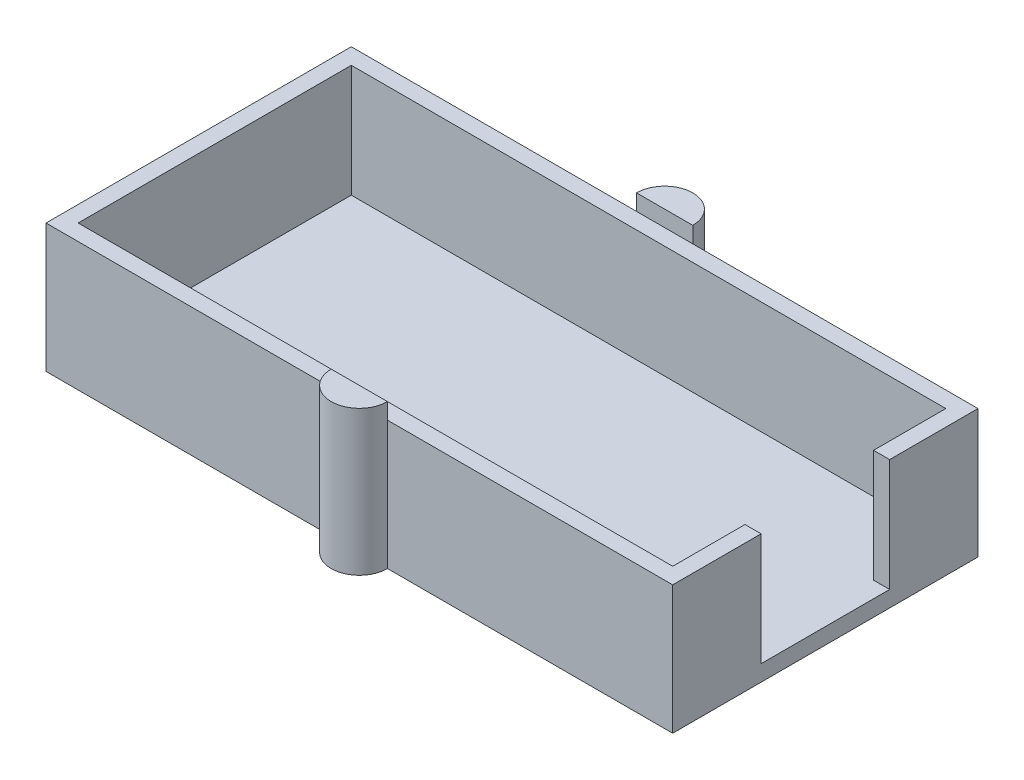
ISO-10303-21;
HEADER;
FILE_DESCRIPTION(('STEP AP214'),'2;1');
FILE_NAME('part.step','',(''),(''),'','','');
FILE_SCHEMA(('AUTOMOTIVE_DESIGN { 1 0 10303 214 1 1 1 1 }'));
ENDSEC;
DATA;
#1=APPLICATION_CONTEXT('core data for automotive mechanical design processes');
#2=APPLICATION_PROTOCOL_DEFINITION('international standard','automotive_design',2000,#1);
#3=PRODUCT_CONTEXT('',#1,'mechanical');
#4=PRODUCT('Part','Part','',(#3));
#5=PRODUCT_RELATED_PRODUCT_CATEGORY('part','',(#4));
#6=PRODUCT_DEFINITION_FORMATION('','',#4);
#7=PRODUCT_DEFINITION_CONTEXT('part definition',#1,'design');
#8=PRODUCT_DEFINITION('design','',#6,#7);
#9=PRODUCT_DEFINITION_SHAPE('','',#8);
#10=(LENGTH_UNIT() NAMED_UNIT(*) SI_UNIT(.MILLI.,.METRE.));
#11=(NAMED_UNIT(*) PLANE_ANGLE_UNIT() SI_UNIT($,.RADIAN.));
#12=(NAMED_UNIT(*) SI_UNIT($,.STERADIAN.) SOLID_ANGLE_UNIT());
#13=UNCERTAINTY_MEASURE_WITH_UNIT(LENGTH_MEASURE(1.E-05),#10,'distance_accuracy_value','');
#14=(GEOMETRIC_REPRESENTATION_CONTEXT(3) GLOBAL_UNCERTAINTY_ASSIGNED_CONTEXT((#13)) GLOBAL_UNIT_ASSIGNED_CONTEXT((#10,
#11,#12)) REPRESENTATION_CONTEXT('',''));
#15=CARTESIAN_POINT('',(0.,0.,0.));
#16=DIRECTION('',(0.,0.,1.));
#17=DIRECTION('',(1.,0.,0.));
#18=AXIS2_PLACEMENT_3D('',#15,#16,#17);
#19=CARTESIAN_POINT('',(51.1184091382947,7.,-21.1566621553229));
#20=DIRECTION('',(-1.,0.,0.));
#21=DIRECTION('',(0.,0.,1.));
#22=AXIS2_PLACEMENT_3D('',#19,#20,#21);
#23=PLANE('',#22);
#24=DIRECTION('',(0.,1.,0.));
#25=VECTOR('',#24,1.);
#26=CARTESIAN_POINT('',(51.1184091382947,7.,-8.65666215532292));
#27=LINE('',#26,#25);
#28=CARTESIAN_POINT('',(51.1184091382947,0.,-8.65666215532292));
#29=VERTEX_POINT('',#28);
#30=CARTESIAN_POINT('',(51.1184091382947,7.,-8.65666215532292));
#31=VERTEX_POINT('',#30);
#32=EDGE_CURVE('E191',#29,#31,#27,.T.);
#33=ORIENTED_EDGE('',*,*,#32,.F.);
#34=DIRECTION('',(0.,0.,-1.));
#35=VECTOR('',#34,1.);
#36=CARTESIAN_POINT('',(51.1184091382947,0.,-21.1566621553229));
#37=LINE('',#36,#35);
#38=CARTESIAN_POINT('',(51.1184091382947,0.,-4.15666215532293));
#39=VERTEX_POINT('',#38);
#40=EDGE_CURVE('E165',#39,#29,#37,.T.);
#41=ORIENTED_EDGE('',*,*,#40,.F.);
#42=DIRECTION('',(0.,-1.,0.));
#43=VECTOR('',#42,1.);
#44=CARTESIAN_POINT('',(51.1184091382947,7.,-4.15666215532293));
#45=LINE('',#44,#43);
#46=CARTESIAN_POINT('',(51.1184091382947,7.,-4.15666215532293));
#47=VERTEX_POINT('',#46);
#48=EDGE_CURVE('E272',#47,#39,#45,.T.);
#49=ORIENTED_EDGE('',*,*,#48,.F.);
#50=DIRECTION('',(0.,0.,-1.));
#51=VECTOR('',#50,1.);
#52=CARTESIAN_POINT('',(51.1184091382947,7.,-21.1566621553229));
#53=LINE('',#52,#51);
#54=EDGE_CURVE('E255',#47,#31,#53,.T.);
#55=ORIENTED_EDGE('',*,*,#54,.T.);
#56=EDGE_LOOP('',(#33,#41,#49,#55));
#57=FACE_BOUND('',#56,.T.);
#58=ADVANCED_FACE('F33',(#57),#23,.T.);
#59=CARTESIAN_POINT('',(13.1184091382947,7.,-3.15666215532293));
#60=DIRECTION('',(0.,0.,-1.));
#61=DIRECTION('',(-1.,0.,0.));
#62=AXIS2_PLACEMENT_3D('',#59,#60,#61);
#63=PLANE('',#62);
#64=DIRECTION('',(1.,0.,0.));
#65=VECTOR('',#64,1.);
#66=CARTESIAN_POINT('',(13.1184091382947,7.,-3.15666215532293));
#67=LINE('',#66,#65);
#68=CARTESIAN_POINT('',(34.3684091382947,7.,-3.15666215532293));
#69=VERTEX_POINT('',#68);
#70=CARTESIAN_POINT('',(52.1184091382947,7.,-3.15666215532293));
#71=VERTEX_POINT('',#70);
#72=EDGE_CURVE('E280',#69,#71,#67,.T.);
#73=ORIENTED_EDGE('',*,*,#72,.F.);
#74=DIRECTION('',(0.,1.,0.));
#75=VECTOR('',#74,1.);
#76=CARTESIAN_POINT('',(34.3684091382947,-1.,-3.15666215532293));
#77=LINE('',#76,#75);
#78=CARTESIAN_POINT('',(34.3684091382947,-1.,-3.15666215532293));
#79=VERTEX_POINT('',#78);
#80=EDGE_CURVE('E243',#79,#69,#77,.T.);
#81=ORIENTED_EDGE('',*,*,#80,.F.);
#82=DIRECTION('',(-1.,0.,0.));
#83=VECTOR('',#82,1.);
#84=CARTESIAN_POINT('',(34.3684091382947,-1.,-3.15666215532293));
#85=LINE('',#84,#83);
#86=CARTESIAN_POINT('',(52.1184091382947,-1.,-3.15666215532293));
#87=VERTEX_POINT('',#86);
#88=EDGE_CURVE('E234',#87,#79,#85,.T.);
#89=ORIENTED_EDGE('',*,*,#88,.F.);
#90=DIRECTION('',(0.,-1.,0.));
#91=VECTOR('',#90,1.);
#92=CARTESIAN_POINT('',(52.1184091382947,7.,-3.15666215532293));
#93=LINE('',#92,#91);
#94=EDGE_CURVE('E41',#71,#87,#93,.T.);
#95=ORIENTED_EDGE('',*,*,#94,.F.);
#96=EDGE_LOOP('',(#73,#81,#89,#95));
#97=FACE_BOUND('',#96,.T.);
#98=ADVANCED_FACE('F304',(#97),#63,.F.);
#99=DIRECTION('',(0.,1.,0.));
#100=VECTOR('',#99,1.);
#101=CARTESIAN_POINT('',(30.8684091382947,-1.,-3.15666215532293));
#102=LINE('',#101,#100);
#103=CARTESIAN_POINT('',(30.8684091382947,-1.,-3.15666215532293));
#104=VERTEX_POINT('',#103);
#105=CARTESIAN_POINT('',(30.8684091382947,7.,-3.15666215532293));
#106=VERTEX_POINT('',#105);
#107=EDGE_CURVE('E241',#104,#106,#102,.T.);
#108=ORIENTED_EDGE('',*,*,#107,.T.);
#109=CARTESIAN_POINT('',(13.1184091382947,7.,-3.15666215532293));
#110=VERTEX_POINT('',#109);
#111=EDGE_CURVE('E281',#110,#106,#67,.T.);
#112=ORIENTED_EDGE('',*,*,#111,.F.);
#113=DIRECTION('',(0.,-1.,0.));
#114=VECTOR('',#113,1.);
#115=CARTESIAN_POINT('',(13.1184091382947,7.,-3.15666215532293));
#116=LINE('',#115,#114);
#117=CARTESIAN_POINT('',(13.1184091382947,-1.,-3.15666215532293));
#118=VERTEX_POINT('',#117);
#119=EDGE_CURVE('E11',#110,#118,#116,.T.);
#120=ORIENTED_EDGE('',*,*,#119,.T.);
#121=DIRECTION('',(-1.,0.,0.));
#122=VECTOR('',#121,1.);
#123=CARTESIAN_POINT('',(13.1184091382947,-1.,-3.15666215532293));
#124=LINE('',#123,#122);
#125=EDGE_CURVE('E238',#104,#118,#124,.T.);
#126=ORIENTED_EDGE('',*,*,#125,.F.);
#127=EDGE_LOOP('',(#108,#112,#120,#126));
#128=FACE_BOUND('',#127,.T.);
#129=ADVANCED_FACE('F359',(#128),#63,.F.);
#130=CARTESIAN_POINT('',(13.1184091382947,7.,-22.1566621553229));
#131=DIRECTION('',(0.,0.,1.));
#132=DIRECTION('',(1.,0.,0.));
#133=AXIS2_PLACEMENT_3D('',#130,#131,#132);
#134=PLANE('',#133);
#135=DIRECTION('',(-1.,0.,0.));
#136=VECTOR('',#135,1.);
#137=CARTESIAN_POINT('',(13.1184091382947,7.,-22.1566621553229));
#138=LINE('',#137,#136);
#139=CARTESIAN_POINT('',(30.8684091382947,7.,-22.1566621553228));
#140=VERTEX_POINT('',#139);
#141=CARTESIAN_POINT('',(13.1184091382947,7.,-22.1566621553229));
#142=VERTEX_POINT('',#141);
#143=EDGE_CURVE('E287',#140,#142,#138,.T.);
#144=ORIENTED_EDGE('',*,*,#143,.F.);
#145=DIRECTION('',(0.,1.,0.));
#146=VECTOR('',#145,1.);
#147=CARTESIAN_POINT('',(30.8684091382947,-1.,-22.1566621553229));
#148=LINE('',#147,#146);
#149=CARTESIAN_POINT('',(30.8684091382947,-1.,-22.1566621553229));
#150=VERTEX_POINT('',#149);
#151=EDGE_CURVE('E247',#150,#140,#148,.T.);
#152=ORIENTED_EDGE('',*,*,#151,.F.);
#153=DIRECTION('',(1.,0.,0.));
#154=VECTOR('',#153,1.);
#155=CARTESIAN_POINT('',(13.1184091382947,-1.,-22.1566621553229));
#156=LINE('',#155,#154);
#157=CARTESIAN_POINT('',(13.1184091382947,-1.,-22.1566621553229));
#158=VERTEX_POINT('',#157);
#159=EDGE_CURVE('E224',#158,#150,#156,.T.);
#160=ORIENTED_EDGE('',*,*,#159,.F.);
#161=DIRECTION('',(0.,-1.,0.));
#162=VECTOR('',#161,1.);
#163=CARTESIAN_POINT('',(13.1184091382947,7.,-22.1566621553229));
#164=LINE('',#163,#162);
#165=EDGE_CURVE('E291',#142,#158,#164,.T.);
#166=ORIENTED_EDGE('',*,*,#165,.F.);
#167=EDGE_LOOP('',(#144,#152,#160,#166));
#168=FACE_BOUND('',#167,.T.);
#169=ADVANCED_FACE('F321',(#168),#134,.F.);
#170=DIRECTION('',(0.,1.,0.));
#171=VECTOR('',#170,1.);
#172=CARTESIAN_POINT('',(34.3684091382947,-1.,-22.1566621553229));
#173=LINE('',#172,#171);
#174=CARTESIAN_POINT('',(34.3684091382947,-1.,-22.1566621553229));
#175=VERTEX_POINT('',#174);
#176=CARTESIAN_POINT('',(34.3684091382947,7.,-22.1566621553229));
#177=VERTEX_POINT('',#176);
#178=EDGE_CURVE('E245',#175,#177,#173,.T.);
#179=ORIENTED_EDGE('',*,*,#178,.T.);
#180=CARTESIAN_POINT('',(52.1184091382947,7.,-22.1566621553229));
#181=VERTEX_POINT('',#180);
#182=EDGE_CURVE('E288',#181,#177,#138,.T.);
#183=ORIENTED_EDGE('',*,*,#182,.F.);
#184=DIRECTION('',(0.,-1.,0.));
#185=VECTOR('',#184,1.);
#186=CARTESIAN_POINT('',(52.1184091382947,7.,-22.1566621553229));
#187=LINE('',#186,#185);
#188=CARTESIAN_POINT('',(52.1184091382947,-1.,-22.1566621553229));
#189=VERTEX_POINT('',#188);
#190=EDGE_CURVE('E293',#181,#189,#187,.T.);
#191=ORIENTED_EDGE('',*,*,#190,.T.);
#192=DIRECTION('',(1.,0.,0.));
#193=VECTOR('',#192,1.);
#194=CARTESIAN_POINT('',(34.3684091382947,-1.,-22.1566621553229));
#195=LINE('',#194,#193);
#196=EDGE_CURVE('E228',#175,#189,#195,.T.);
#197=ORIENTED_EDGE('',*,*,#196,.F.);
#198=EDGE_LOOP('',(#179,#183,#191,#197));
#199=FACE_BOUND('',#198,.T.);
#200=ADVANCED_FACE('F331',(#199),#134,.F.);
#201=CARTESIAN_POINT('',(0.,7.,0.));
#202=DIRECTION('',(0.,1.,0.));
#203=DIRECTION('',(0.,0.,1.));
#204=AXIS2_PLACEMENT_3D('',#201,#202,#203);
#205=PLANE('',#204);
#206=DIRECTION('',(1.,0.,0.));
#207=VECTOR('',#206,1.);
#208=CARTESIAN_POINT('',(44.1184091382947,7.,-8.65666215532292));
#209=LINE('',#208,#207);
#210=CARTESIAN_POINT('',(52.1184091382947,7.,-8.65666215532292));
#211=VERTEX_POINT('',#210);
#212=EDGE_CURVE('E174',#31,#211,#209,.T.);
#213=ORIENTED_EDGE('',*,*,#212,.F.);
#214=ORIENTED_EDGE('',*,*,#54,.F.);
#215=DIRECTION('',(1.,0.,0.));
#216=VECTOR('',#215,1.);
#217=CARTESIAN_POINT('',(14.1184091382947,7.,-4.15666215532293));
#218=LINE('',#217,#216);
#219=CARTESIAN_POINT('',(14.1184091382947,7.,-4.15666215532293));
#220=VERTEX_POINT('',#219);
#221=EDGE_CURVE('E252',#220,#47,#218,.T.);
#222=ORIENTED_EDGE('',*,*,#221,.F.);
#223=DIRECTION('',(0.,0.,1.));
#224=VECTOR('',#223,1.);
#225=CARTESIAN_POINT('',(14.1184091382947,7.,-21.1566621553229));
#226=LINE('',#225,#224);
#227=CARTESIAN_POINT('',(14.1184091382947,7.,-21.1566621553229));
#228=VERTEX_POINT('',#227);
#229=EDGE_CURVE('E250',#228,#220,#226,.T.);
#230=ORIENTED_EDGE('',*,*,#229,.F.);
#231=DIRECTION('',(-1.,0.,0.));
#232=VECTOR('',#231,1.);
#233=CARTESIAN_POINT('',(14.1184091382947,7.,-21.1566621553229));
#234=LINE('',#233,#232);
#235=CARTESIAN_POINT('',(51.1184091382947,7.,-21.1566621553229));
#236=VERTEX_POINT('',#235);
#237=EDGE_CURVE('E258',#236,#228,#234,.T.);
#238=ORIENTED_EDGE('',*,*,#237,.F.);
#239=CARTESIAN_POINT('',(51.1184091382947,7.,-16.6566621553229));
#240=VERTEX_POINT('',#239);
#241=EDGE_CURVE('E56',#240,#236,#53,.T.);
#242=ORIENTED_EDGE('',*,*,#241,.F.);
#243=DIRECTION('',(1.,0.,0.));
#244=VECTOR('',#243,1.);
#245=CARTESIAN_POINT('',(44.1184091382947,7.,-16.6566621553229));
#246=LINE('',#245,#244);
#247=CARTESIAN_POINT('',(52.1184091382947,7.,-16.6566621553229));
#248=VERTEX_POINT('',#247);
#249=EDGE_CURVE('E186',#240,#248,#246,.T.);
#250=ORIENTED_EDGE('',*,*,#249,.T.);
#251=DIRECTION('',(0.,0.,-1.));
#252=VECTOR('',#251,1.);
#253=CARTESIAN_POINT('',(52.1184091382947,7.,-22.1566621553229));
#254=LINE('',#253,#252);
#255=EDGE_CURVE('E284',#248,#181,#254,.T.);
#256=ORIENTED_EDGE('',*,*,#255,.T.);
#257=ORIENTED_EDGE('',*,*,#182,.T.);
#258=DIRECTION('',(-1.,0.,0.));
#259=VECTOR('',#258,1.);
#260=CARTESIAN_POINT('',(-8.12640133505464E-13,7.,-22.1566621553217));
#261=LINE('',#260,#259);
#262=EDGE_CURVE('E218',#177,#140,#261,.T.);
#263=ORIENTED_EDGE('',*,*,#262,.T.);
#264=ORIENTED_EDGE('',*,*,#143,.T.);
#265=DIRECTION('',(0.,0.,1.));
#266=VECTOR('',#265,1.);
#267=CARTESIAN_POINT('',(13.1184091382947,7.,-22.1566621553229));
#268=LINE('',#267,#266);
#269=EDGE_CURVE('E277',#142,#110,#268,.T.);
#270=ORIENTED_EDGE('',*,*,#269,.T.);
#271=ORIENTED_EDGE('',*,*,#111,.T.);
#272=DIRECTION('',(1.,0.,0.));
#273=VECTOR('',#272,1.);
#274=CARTESIAN_POINT('',(0.,7.,-3.15666215532293));
#275=LINE('',#274,#273);
#276=EDGE_CURVE('E204',#106,#69,#275,.T.);
#277=ORIENTED_EDGE('',*,*,#276,.T.);
#278=ORIENTED_EDGE('',*,*,#72,.T.);
#279=EDGE_CURVE('E285',#71,#211,#254,.T.);
#280=ORIENTED_EDGE('',*,*,#279,.T.);
#281=EDGE_LOOP('',(#213,#214,#222,#230,#238,#242,#250,#256,#257,#263,#264,#270,#271,#277,#278,#280));
#282=FACE_BOUND('',#281,.T.);
#283=ADVANCED_FACE('F333',(#282),#205,.T.);
#284=CARTESIAN_POINT('',(13.1184091382947,7.,-22.1566621553229));
#285=DIRECTION('',(1.,0.,0.));
#286=DIRECTION('',(0.,0.,-1.));
#287=AXIS2_PLACEMENT_3D('',#284,#285,#286);
#288=PLANE('',#287);
#289=ORIENTED_EDGE('',*,*,#165,.T.);
#290=DIRECTION('',(0.,0.,-1.));
#291=VECTOR('',#290,1.);
#292=CARTESIAN_POINT('',(13.1184091382947,-1.,-3.15666215532293));
#293=LINE('',#292,#291);
#294=EDGE_CURVE('E221',#118,#158,#293,.T.);
#295=ORIENTED_EDGE('',*,*,#294,.F.);
#296=ORIENTED_EDGE('',*,*,#119,.F.);
#297=ORIENTED_EDGE('',*,*,#269,.F.);
#298=EDGE_LOOP('',(#289,#295,#296,#297));
#299=FACE_BOUND('',#298,.T.);
#300=ADVANCED_FACE('F35',(#299),#288,.F.);
#301=CARTESIAN_POINT('',(52.1184091382947,7.,-22.1566621553229));
#302=DIRECTION('',(-1.,0.,0.));
#303=DIRECTION('',(0.,0.,1.));
#304=AXIS2_PLACEMENT_3D('',#301,#302,#303);
#305=PLANE('',#304);
#306=DIRECTION('',(0.,0.,-1.));
#307=VECTOR('',#306,1.);
#308=CARTESIAN_POINT('',(52.1184091382947,0.,-8.65666215532292));
#309=LINE('',#308,#307);
#310=CARTESIAN_POINT('',(52.1184091382947,0.,-8.65666215532292));
#311=VERTEX_POINT('',#310);
#312=CARTESIAN_POINT('',(52.1184091382947,0.,-16.6566621553229));
#313=VERTEX_POINT('',#312);
#314=EDGE_CURVE('E161',#311,#313,#309,.T.);
#315=ORIENTED_EDGE('',*,*,#314,.F.);
#316=DIRECTION('',(0.,-1.,0.));
#317=VECTOR('',#316,1.);
#318=CARTESIAN_POINT('',(52.1184091382947,7.,-8.65666215532292));
#319=LINE('',#318,#317);
#320=EDGE_CURVE('E171',#211,#311,#319,.T.);
#321=ORIENTED_EDGE('',*,*,#320,.F.);
#322=ORIENTED_EDGE('',*,*,#279,.F.);
#323=ORIENTED_EDGE('',*,*,#94,.T.);
#324=DIRECTION('',(0.,0.,1.));
#325=VECTOR('',#324,1.);
#326=CARTESIAN_POINT('',(52.1184091382947,-1.,-3.15666215532293));
#327=LINE('',#326,#325);
#328=EDGE_CURVE('E231',#189,#87,#327,.T.);
#329=ORIENTED_EDGE('',*,*,#328,.F.);
#330=ORIENTED_EDGE('',*,*,#190,.F.);
#331=ORIENTED_EDGE('',*,*,#255,.F.);
#332=DIRECTION('',(0.,1.,0.));
#333=VECTOR('',#332,1.);
#334=CARTESIAN_POINT('',(52.1184091382947,7.,-16.6566621553229));
#335=LINE('',#334,#333);
#336=EDGE_CURVE('E168',#313,#248,#335,.T.);
#337=ORIENTED_EDGE('',*,*,#336,.F.);
#338=EDGE_LOOP('',(#315,#321,#322,#323,#329,#330,#331,#337));
#339=FACE_BOUND('',#338,.T.);
#340=ADVANCED_FACE('F179',(#339),#305,.F.);
#341=CARTESIAN_POINT('',(14.1184091382947,7.,-21.1566621553229));
#342=DIRECTION('',(1.,0.,0.));
#343=DIRECTION('',(0.,0.,-1.));
#344=AXIS2_PLACEMENT_3D('',#341,#342,#343);
#345=PLANE('',#344);
#346=DIRECTION('',(0.,0.,1.));
#347=VECTOR('',#346,1.);
#348=CARTESIAN_POINT('',(14.1184091382947,0.,-21.1566621553229));
#349=LINE('',#348,#347);
#350=CARTESIAN_POINT('',(14.1184091382947,0.,-21.1566621553229));
#351=VERTEX_POINT('',#350);
#352=CARTESIAN_POINT('',(14.1184091382947,0.,-4.15666215532293));
#353=VERTEX_POINT('',#352);
#354=EDGE_CURVE('E249',#351,#353,#349,.T.);
#355=ORIENTED_EDGE('',*,*,#354,.F.);
#356=DIRECTION('',(0.,-1.,0.));
#357=VECTOR('',#356,1.);
#358=CARTESIAN_POINT('',(14.1184091382947,7.,-21.1566621553229));
#359=LINE('',#358,#357);
#360=EDGE_CURVE('E260',#228,#351,#359,.T.);
#361=ORIENTED_EDGE('',*,*,#360,.F.);
#362=ORIENTED_EDGE('',*,*,#229,.T.);
#363=DIRECTION('',(0.,-1.,0.));
#364=VECTOR('',#363,1.);
#365=CARTESIAN_POINT('',(14.1184091382947,7.,-4.15666215532293));
#366=LINE('',#365,#364);
#367=EDGE_CURVE('E274',#220,#353,#366,.T.);
#368=ORIENTED_EDGE('',*,*,#367,.T.);
#369=EDGE_LOOP('',(#355,#361,#362,#368));
#370=FACE_BOUND('',#369,.T.);
#371=ADVANCED_FACE('F346',(#370),#345,.T.);
#372=CARTESIAN_POINT('',(14.1184091382947,7.,-4.15666215532293));
#373=DIRECTION('',(0.,0.,-1.));
#374=DIRECTION('',(-1.,0.,0.));
#375=AXIS2_PLACEMENT_3D('',#372,#373,#374);
#376=PLANE('',#375);
#377=DIRECTION('',(1.,0.,0.));
#378=VECTOR('',#377,1.);
#379=CARTESIAN_POINT('',(14.1184091382947,0.,-4.15666215532293));
#380=LINE('',#379,#378);
#381=EDGE_CURVE('E263',#353,#39,#380,.T.);
#382=ORIENTED_EDGE('',*,*,#381,.F.);
#383=ORIENTED_EDGE('',*,*,#367,.F.);
#384=ORIENTED_EDGE('',*,*,#221,.T.);
#385=ORIENTED_EDGE('',*,*,#48,.T.);
#386=EDGE_LOOP('',(#382,#383,#384,#385));
#387=FACE_BOUND('',#386,.T.);
#388=ADVANCED_FACE('F350',(#387),#376,.T.);
#389=DIRECTION('',(0.,-1.,0.));
#390=VECTOR('',#389,1.);
#391=CARTESIAN_POINT('',(51.1184091382947,7.,-16.6566621553229));
#392=LINE('',#391,#390);
#393=CARTESIAN_POINT('',(51.1184091382947,0.,-16.6566621553229));
#394=VERTEX_POINT('',#393);
#395=EDGE_CURVE('E185',#240,#394,#392,.T.);
#396=ORIENTED_EDGE('',*,*,#395,.F.);
#397=ORIENTED_EDGE('',*,*,#241,.T.);
#398=DIRECTION('',(0.,-1.,0.));
#399=VECTOR('',#398,1.);
#400=CARTESIAN_POINT('',(51.1184091382947,7.,-21.1566621553229));
#401=LINE('',#400,#399);
#402=CARTESIAN_POINT('',(51.1184091382947,0.,-21.1566621553229));
#403=VERTEX_POINT('',#402);
#404=EDGE_CURVE('E270',#236,#403,#401,.T.);
#405=ORIENTED_EDGE('',*,*,#404,.T.);
#406=EDGE_CURVE('E265',#394,#403,#37,.T.);
#407=ORIENTED_EDGE('',*,*,#406,.F.);
#408=EDGE_LOOP('',(#396,#397,#405,#407));
#409=FACE_BOUND('',#408,.T.);
#410=ADVANCED_FACE('F338',(#409),#23,.T.);
#411=CARTESIAN_POINT('',(14.1184091382947,7.,-21.1566621553229));
#412=DIRECTION('',(0.,0.,1.));
#413=DIRECTION('',(1.,0.,0.));
#414=AXIS2_PLACEMENT_3D('',#411,#412,#413);
#415=PLANE('',#414);
#416=DIRECTION('',(-1.,0.,0.));
#417=VECTOR('',#416,1.);
#418=CARTESIAN_POINT('',(14.1184091382947,0.,-21.1566621553229));
#419=LINE('',#418,#417);
#420=EDGE_CURVE('E253',#403,#351,#419,.T.);
#421=ORIENTED_EDGE('',*,*,#420,.F.);
#422=ORIENTED_EDGE('',*,*,#404,.F.);
#423=ORIENTED_EDGE('',*,*,#237,.T.);
#424=ORIENTED_EDGE('',*,*,#360,.T.);
#425=EDGE_LOOP('',(#421,#422,#423,#424));
#426=FACE_BOUND('',#425,.T.);
#427=ADVANCED_FACE('F342',(#426),#415,.T.);
#428=CARTESIAN_POINT('',(32.6184091382947,0.,-22.1566621553229));
#429=DIRECTION('',(0.,-1.,0.));
#430=DIRECTION('',(0.,0.,-1.));
#431=AXIS2_PLACEMENT_3D('',#428,#429,#430);
#432=PLANE('',#431);
#433=ORIENTED_EDGE('',*,*,#40,.T.);
#434=DIRECTION('',(1.,0.,0.));
#435=VECTOR('',#434,1.);
#436=CARTESIAN_POINT('',(44.1184091382947,0.,-8.65666215532292));
#437=LINE('',#436,#435);
#438=EDGE_CURVE('E157',#29,#311,#437,.T.);
#439=ORIENTED_EDGE('',*,*,#438,.T.);
#440=ORIENTED_EDGE('',*,*,#314,.T.);
#441=DIRECTION('',(1.,0.,0.));
#442=VECTOR('',#441,1.);
#443=CARTESIAN_POINT('',(44.1184091382947,0.,-16.6566621553229));
#444=LINE('',#443,#442);
#445=EDGE_CURVE('E48',#394,#313,#444,.T.);
#446=ORIENTED_EDGE('',*,*,#445,.F.);
#447=ORIENTED_EDGE('',*,*,#406,.T.);
#448=ORIENTED_EDGE('',*,*,#420,.T.);
#449=ORIENTED_EDGE('',*,*,#354,.T.);
#450=ORIENTED_EDGE('',*,*,#381,.T.);
#451=EDGE_LOOP('',(#433,#439,#440,#446,#447,#448,#449,#450));
#452=FACE_BOUND('',#451,.T.);
#453=ADVANCED_FACE('F159',(#452),#432,.F.);
#454=CARTESIAN_POINT('',(32.6184091382947,-1.,-22.1566621553229));
#455=DIRECTION('',(0.,1.,0.));
#456=DIRECTION('',(0.,0.,1.));
#457=AXIS2_PLACEMENT_3D('',#454,#455,#456);
#458=CYLINDRICAL_SURFACE('',#457,1.75);
#459=ORIENTED_EDGE('',*,*,#151,.T.);
#460=DIRECTION('',(0.,-1.,0.));
#461=VECTOR('',#460,1.);
#462=CARTESIAN_POINT('',(30.8684091382947,8.,-22.1566621553228));
#463=LINE('',#462,#461);
#464=CARTESIAN_POINT('',(30.8684091382947,8.,-22.1566621553228));
#465=VERTEX_POINT('',#464);
#466=EDGE_CURVE('E215',#465,#140,#463,.T.);
#467=ORIENTED_EDGE('',*,*,#466,.F.);
#468=CARTESIAN_POINT('',(32.6184091382947,8.,-22.1566621553228));
#469=DIRECTION('',(0.,1.,0.));
#470=DIRECTION('',(0.,0.,1.));
#471=AXIS2_PLACEMENT_3D('',#468,#469,#470);
#472=CIRCLE('',#471,1.75);
#473=CARTESIAN_POINT('',(34.3684091382947,8.,-22.1566621553229));
#474=VERTEX_POINT('',#473);
#475=EDGE_CURVE('E207',#474,#465,#472,.T.);
#476=ORIENTED_EDGE('',*,*,#475,.F.);
#477=DIRECTION('',(0.,-1.,0.));
#478=VECTOR('',#477,1.);
#479=CARTESIAN_POINT('',(34.3684091382947,8.,-22.1566621553229));
#480=LINE('',#479,#478);
#481=EDGE_CURVE('E212',#474,#177,#480,.T.);
#482=ORIENTED_EDGE('',*,*,#481,.T.);
#483=ORIENTED_EDGE('',*,*,#178,.F.);
#484=CARTESIAN_POINT('',(32.6184091382947,-1.,-22.1566621553229));
#485=DIRECTION('',(0.,-1.,0.));
#486=DIRECTION('',(0.,0.,-1.));
#487=AXIS2_PLACEMENT_3D('',#484,#485,#486);
#488=CIRCLE('',#487,1.75);
#489=EDGE_CURVE('E226',#150,#175,#488,.T.);
#490=ORIENTED_EDGE('',*,*,#489,.F.);
#491=EDGE_LOOP('',(#459,#467,#476,#482,#483,#490));
#492=FACE_BOUND('',#491,.T.);
#493=ADVANCED_FACE('F325',(#492),#458,.T.);
#494=CARTESIAN_POINT('',(32.6184091382947,-1.,-3.15666215532293));
#495=DIRECTION('',(0.,1.,0.));
#496=DIRECTION('',(0.,0.,1.));
#497=AXIS2_PLACEMENT_3D('',#494,#495,#496);
#498=CYLINDRICAL_SURFACE('',#497,1.75);
#499=ORIENTED_EDGE('',*,*,#80,.T.);
#500=DIRECTION('',(0.,-1.,0.));
#501=VECTOR('',#500,1.);
#502=CARTESIAN_POINT('',(34.3684091382947,8.,-3.15666215532293));
#503=LINE('',#502,#501);
#504=CARTESIAN_POINT('',(34.3684091382947,8.,-3.15666215532293));
#505=VERTEX_POINT('',#504);
#506=EDGE_CURVE('E201',#505,#69,#503,.T.);
#507=ORIENTED_EDGE('',*,*,#506,.F.);
#508=CARTESIAN_POINT('',(32.6184091382947,8.,-3.15666215532293));
#509=DIRECTION('',(0.,1.,0.));
#510=DIRECTION('',(0.,0.,1.));
#511=AXIS2_PLACEMENT_3D('',#508,#509,#510);
#512=CIRCLE('',#511,1.75);
#513=CARTESIAN_POINT('',(30.8684091382947,8.,-3.15666215532293));
#514=VERTEX_POINT('',#513);
#515=EDGE_CURVE('E193',#514,#505,#512,.T.);
#516=ORIENTED_EDGE('',*,*,#515,.F.);
#517=DIRECTION('',(0.,-1.,0.));
#518=VECTOR('',#517,1.);
#519=CARTESIAN_POINT('',(30.8684091382947,8.,-3.15666215532293));
#520=LINE('',#519,#518);
#521=EDGE_CURVE('E198',#514,#106,#520,.T.);
#522=ORIENTED_EDGE('',*,*,#521,.T.);
#523=ORIENTED_EDGE('',*,*,#107,.F.);
#524=CARTESIAN_POINT('',(32.6184091382947,-1.,-3.15666215532293));
#525=DIRECTION('',(0.,-1.,0.));
#526=DIRECTION('',(0.,0.,-1.));
#527=AXIS2_PLACEMENT_3D('',#524,#525,#526);
#528=CIRCLE('',#527,1.75);
#529=EDGE_CURVE('E236',#79,#104,#528,.T.);
#530=ORIENTED_EDGE('',*,*,#529,.F.);
#531=EDGE_LOOP('',(#499,#507,#516,#522,#523,#530));
#532=FACE_BOUND('',#531,.T.);
#533=ADVANCED_FACE('F309',(#532),#498,.T.);
#534=CARTESIAN_POINT('',(32.6184091382947,-1.,-22.1566621553229));
#535=DIRECTION('',(0.,-1.,0.));
#536=DIRECTION('',(0.,0.,-1.));
#537=AXIS2_PLACEMENT_3D('',#534,#535,#536);
#538=PLANE('',#537);
#539=ORIENTED_EDGE('',*,*,#294,.T.);
#540=ORIENTED_EDGE('',*,*,#159,.T.);
#541=ORIENTED_EDGE('',*,*,#489,.T.);
#542=ORIENTED_EDGE('',*,*,#196,.T.);
#543=ORIENTED_EDGE('',*,*,#328,.T.);
#544=ORIENTED_EDGE('',*,*,#88,.T.);
#545=ORIENTED_EDGE('',*,*,#529,.T.);
#546=ORIENTED_EDGE('',*,*,#125,.T.);
#547=EDGE_LOOP('',(#539,#540,#541,#542,#543,#544,#545,#546));
#548=FACE_BOUND('',#547,.T.);
#549=ADVANCED_FACE('F301',(#548),#538,.T.);
#550=CARTESIAN_POINT('',(30.8684091382947,8.,-22.1566621553228));
#551=DIRECTION('',(0.,0.,-1.));
#552=DIRECTION('',(-1.,0.,0.));
#553=AXIS2_PLACEMENT_3D('',#550,#551,#552);
#554=PLANE('',#553);
#555=ORIENTED_EDGE('',*,*,#262,.F.);
#556=ORIENTED_EDGE('',*,*,#481,.F.);
#557=DIRECTION('',(1.,0.,0.));
#558=VECTOR('',#557,1.);
#559=CARTESIAN_POINT('',(30.8684091382947,8.,-22.1566621553228));
#560=LINE('',#559,#558);
#561=EDGE_CURVE('E210',#465,#474,#560,.T.);
#562=ORIENTED_EDGE('',*,*,#561,.F.);
#563=ORIENTED_EDGE('',*,*,#466,.T.);
#564=EDGE_LOOP('',(#555,#556,#562,#563));
#565=FACE_BOUND('',#564,.T.);
#566=ADVANCED_FACE('F417',(#565),#554,.F.);
#567=CARTESIAN_POINT('',(32.6184091382947,8.,-22.1566621553228));
#568=DIRECTION('',(0.,1.,0.));
#569=DIRECTION('',(0.,0.,1.));
#570=AXIS2_PLACEMENT_3D('',#567,#568,#569);
#571=PLANE('',#570);
#572=ORIENTED_EDGE('',*,*,#475,.T.);
#573=ORIENTED_EDGE('',*,*,#561,.T.);
#574=EDGE_LOOP('',(#572,#573));
#575=FACE_BOUND('',#574,.T.);
#576=ADVANCED_FACE('F486',(#575),#571,.T.);
#577=CARTESIAN_POINT('',(30.8684091382947,8.,-3.15666215532293));
#578=DIRECTION('',(0.,0.,1.));
#579=DIRECTION('',(1.,0.,0.));
#580=AXIS2_PLACEMENT_3D('',#577,#578,#579);
#581=PLANE('',#580);
#582=ORIENTED_EDGE('',*,*,#276,.F.);
#583=ORIENTED_EDGE('',*,*,#521,.F.);
#584=DIRECTION('',(-1.,0.,0.));
#585=VECTOR('',#584,1.);
#586=CARTESIAN_POINT('',(30.8684091382947,8.,-3.15666215532293));
#587=LINE('',#586,#585);
#588=EDGE_CURVE('E196',#505,#514,#587,.T.);
#589=ORIENTED_EDGE('',*,*,#588,.F.);
#590=ORIENTED_EDGE('',*,*,#506,.T.);
#591=EDGE_LOOP('',(#582,#583,#589,#590));
#592=FACE_BOUND('',#591,.T.);
#593=ADVANCED_FACE('F495',(#592),#581,.F.);
#594=CARTESIAN_POINT('',(32.6184091382947,8.,-3.15666215532293));
#595=DIRECTION('',(0.,1.,0.));
#596=DIRECTION('',(0.,0.,1.));
#597=AXIS2_PLACEMENT_3D('',#594,#595,#596);
#598=PLANE('',#597);
#599=ORIENTED_EDGE('',*,*,#515,.T.);
#600=ORIENTED_EDGE('',*,*,#588,.T.);
#601=EDGE_LOOP('',(#599,#600));
#602=FACE_BOUND('',#601,.T.);
#603=ADVANCED_FACE('F504',(#602),#598,.T.);
#604=CARTESIAN_POINT('',(44.1184091382947,7.,-8.65666215532292));
#605=DIRECTION('',(0.,0.,1.));
#606=DIRECTION('',(1.,0.,0.));
#607=AXIS2_PLACEMENT_3D('',#604,#605,#606);
#608=PLANE('',#607);
#609=ORIENTED_EDGE('',*,*,#32,.T.);
#610=ORIENTED_EDGE('',*,*,#212,.T.);
#611=ORIENTED_EDGE('',*,*,#320,.T.);
#612=ORIENTED_EDGE('',*,*,#438,.F.);
#613=EDGE_LOOP('',(#609,#610,#611,#612));
#614=FACE_BOUND('',#613,.T.);
#615=ADVANCED_FACE('F172',(#614),#608,.F.);
#616=CARTESIAN_POINT('',(44.1184091382947,7.,-16.6566621553229));
#617=DIRECTION('',(0.,0.,-1.));
#618=DIRECTION('',(-1.,0.,0.));
#619=AXIS2_PLACEMENT_3D('',#616,#617,#618);
#620=PLANE('',#619);
#621=ORIENTED_EDGE('',*,*,#395,.T.);
#622=ORIENTED_EDGE('',*,*,#445,.T.);
#623=ORIENTED_EDGE('',*,*,#336,.T.);
#624=ORIENTED_EDGE('',*,*,#249,.F.);
#625=EDGE_LOOP('',(#621,#622,#623,#624));
#626=FACE_BOUND('',#625,.T.);
#627=ADVANCED_FACE('F336',(#626),#620,.F.);
#628=CLOSED_SHELL('',(#58,#98,#129,#169,#200,#283,#300,#340,#371,#388,#410,#427,#453,#493,#533,
#549,#566,#576,#593,#603,#615,#627));
#629=MANIFOLD_SOLID_BREP('B2',#628);
#630=ADVANCED_BREP_SHAPE_REPRESENTATION('',(#18,#629),#14);
#631=SHAPE_DEFINITION_REPRESENTATION(#9,#630);
ENDSEC;
END-ISO-10303-21;
